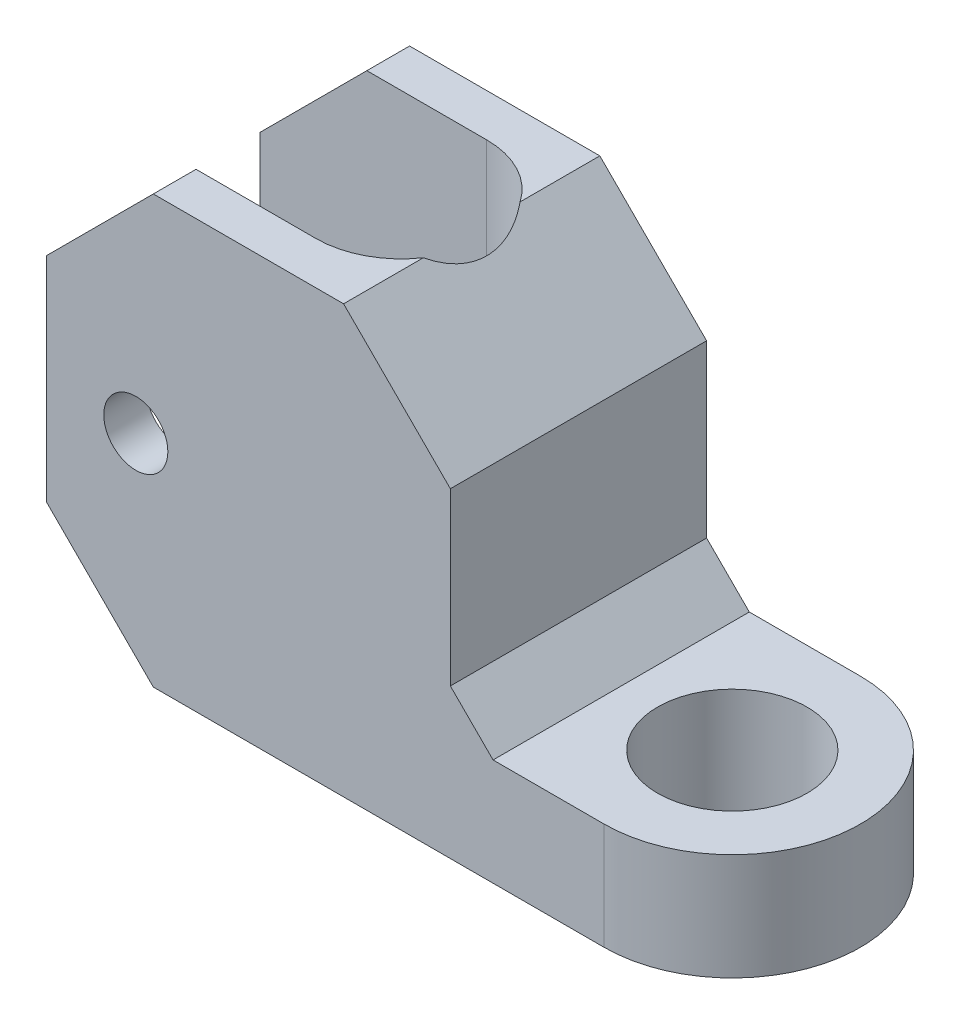
ISO-10303-21;
HEADER;
FILE_DESCRIPTION(('STEP AP214'),'2;1');
FILE_NAME('part.step','',(''),(''),'','','');
FILE_SCHEMA(('AUTOMOTIVE_DESIGN { 1 0 10303 214 1 1 1 1 }'));
ENDSEC;
DATA;
#1=APPLICATION_CONTEXT('core data for automotive mechanical design processes');
#2=APPLICATION_PROTOCOL_DEFINITION('international standard','automotive_design',2000,#1);
#3=PRODUCT_CONTEXT('',#1,'mechanical');
#4=PRODUCT('Part','Part','',(#3));
#5=PRODUCT_RELATED_PRODUCT_CATEGORY('part','',(#4));
#6=PRODUCT_DEFINITION_FORMATION('','',#4);
#7=PRODUCT_DEFINITION_CONTEXT('part definition',#1,'design');
#8=PRODUCT_DEFINITION('design','',#6,#7);
#9=PRODUCT_DEFINITION_SHAPE('','',#8);
#10=(LENGTH_UNIT() NAMED_UNIT(*) SI_UNIT(.MILLI.,.METRE.));
#11=(NAMED_UNIT(*) PLANE_ANGLE_UNIT() SI_UNIT($,.RADIAN.));
#12=(NAMED_UNIT(*) SI_UNIT($,.STERADIAN.) SOLID_ANGLE_UNIT());
#13=UNCERTAINTY_MEASURE_WITH_UNIT(LENGTH_MEASURE(1.E-05),#10,'distance_accuracy_value','');
#14=(GEOMETRIC_REPRESENTATION_CONTEXT(3) GLOBAL_UNCERTAINTY_ASSIGNED_CONTEXT((#13)) GLOBAL_UNIT_ASSIGNED_CONTEXT((#10,
#11,#12)) REPRESENTATION_CONTEXT('',''));
#15=CARTESIAN_POINT('',(0.,0.,0.));
#16=DIRECTION('',(0.,0.,1.));
#17=DIRECTION('',(1.,0.,0.));
#18=AXIS2_PLACEMENT_3D('',#15,#16,#17);
#19=CARTESIAN_POINT('',(0.,20.,0.));
#20=DIRECTION('',(0.,1.,0.));
#21=DIRECTION('',(0.,0.,1.));
#22=AXIS2_PLACEMENT_3D('',#19,#20,#21);
#23=PLANE('',#22);
#24=DIRECTION('',(-1.,0.,0.));
#25=VECTOR('',#24,1.);
#26=CARTESIAN_POINT('',(0.,20.,4.));
#27=LINE('',#26,#25);
#28=CARTESIAN_POINT('',(0.,20.,4.));
#29=VERTEX_POINT('',#28);
#30=CARTESIAN_POINT('',(-5.61459038752232,20.,4.));
#31=VERTEX_POINT('',#30);
#32=EDGE_CURVE('E178',#29,#31,#27,.T.);
#33=ORIENTED_EDGE('',*,*,#32,.T.);
#34=DIRECTION('',(0.,0.,1.));
#35=VECTOR('',#34,1.);
#36=CARTESIAN_POINT('',(-5.61459038752232,20.,6.));
#37=LINE('',#36,#35);
#38=CARTESIAN_POINT('',(-5.61459038752232,20.,6.));
#39=VERTEX_POINT('',#38);
#40=EDGE_CURVE('E280',#31,#39,#37,.T.);
#41=ORIENTED_EDGE('',*,*,#40,.T.);
#42=DIRECTION('',(1.,0.,0.));
#43=VECTOR('',#42,1.);
#44=CARTESIAN_POINT('',(-10.6145903875223,20.,6.));
#45=LINE('',#44,#43);
#46=CARTESIAN_POINT('',(3.29596161791093,20.,6.));
#47=VERTEX_POINT('',#46);
#48=EDGE_CURVE('E181',#39,#47,#45,.T.);
#49=ORIENTED_EDGE('',*,*,#48,.T.);
#50=DIRECTION('',(0.,0.,-1.));
#51=VECTOR('',#50,1.);
#52=CARTESIAN_POINT('',(3.29596161791093,20.,-6.));
#53=LINE('',#52,#51);
#54=CARTESIAN_POINT('',(3.29596161791093,20.,2.26641501346465));
#55=VERTEX_POINT('',#54);
#56=EDGE_CURVE('E239',#47,#55,#53,.T.);
#57=ORIENTED_EDGE('',*,*,#56,.T.);
#58=CARTESIAN_POINT('',(0.,20.,0.));
#59=DIRECTION('',(0.,-1.,0.));
#60=DIRECTION('',(0.,0.,1.));
#61=AXIS2_PLACEMENT_3D('',#58,#59,#60);
#62=CIRCLE('',#61,4.);
#63=EDGE_CURVE('E161',#55,#29,#62,.T.);
#64=ORIENTED_EDGE('',*,*,#63,.T.);
#65=EDGE_LOOP('',(#33,#41,#49,#57,#64));
#66=FACE_BOUND('',#65,.T.);
#67=ADVANCED_FACE('F33',(#66),#23,.T.);
#68=CARTESIAN_POINT('',(15.5,5.,0.));
#69=DIRECTION('',(0.,-1.,0.));
#70=DIRECTION('',(0.,0.,-1.));
#71=AXIS2_PLACEMENT_3D('',#68,#69,#70);
#72=PLANE('',#71);
#73=CARTESIAN_POINT('',(15.5,5.,0.));
#74=DIRECTION('',(0.,1.,0.));
#75=DIRECTION('',(0.,0.,1.));
#76=AXIS2_PLACEMENT_3D('',#73,#74,#75);
#77=CIRCLE('',#76,3.5);
#78=CARTESIAN_POINT('',(15.5,5.,3.5));
#79=VERTEX_POINT('',#78);
#80=EDGE_CURVE('E194',#79,#79,#77,.T.);
#81=ORIENTED_EDGE('',*,*,#80,.F.);
#82=EDGE_LOOP('',(#81));
#83=FACE_BOUND('',#82,.T.);
#84=DIRECTION('',(-1.,0.,0.));
#85=VECTOR('',#84,1.);
#86=CARTESIAN_POINT('',(-10.6145903875223,5.,-6.));
#87=LINE('',#86,#85);
#88=CARTESIAN_POINT('',(15.5,5.,-6.));
#89=VERTEX_POINT('',#88);
#90=CARTESIAN_POINT('',(10.295961617911,5.,-6.));
#91=VERTEX_POINT('',#90);
#92=EDGE_CURVE('E199',#89,#91,#87,.T.);
#93=ORIENTED_EDGE('',*,*,#92,.T.);
#94=DIRECTION('',(0.,0.,1.));
#95=VECTOR('',#94,1.);
#96=CARTESIAN_POINT('',(10.295961617911,5.,6.));
#97=LINE('',#96,#95);
#98=CARTESIAN_POINT('',(10.295961617911,5.,6.));
#99=VERTEX_POINT('',#98);
#100=EDGE_CURVE('E54',#91,#99,#97,.T.);
#101=ORIENTED_EDGE('',*,*,#100,.T.);
#102=DIRECTION('',(1.,0.,0.));
#103=VECTOR('',#102,1.);
#104=CARTESIAN_POINT('',(15.5,5.,6.));
#105=LINE('',#104,#103);
#106=CARTESIAN_POINT('',(15.5,5.,6.));
#107=VERTEX_POINT('',#106);
#108=EDGE_CURVE('E201',#99,#107,#105,.T.);
#109=ORIENTED_EDGE('',*,*,#108,.T.);
#110=CARTESIAN_POINT('',(15.5,5.,0.));
#111=DIRECTION('',(0.,1.,0.));
#112=DIRECTION('',(0.,0.,-1.));
#113=AXIS2_PLACEMENT_3D('',#110,#111,#112);
#114=CIRCLE('',#113,6.);
#115=EDGE_CURVE('E204',#107,#89,#114,.T.);
#116=ORIENTED_EDGE('',*,*,#115,.T.);
#117=EDGE_LOOP('',(#93,#101,#109,#116));
#118=FACE_BOUND('',#117,.T.);
#119=ADVANCED_FACE('F315',(#83,#118),#72,.F.);
#120=CARTESIAN_POINT('',(15.5,0.,0.));
#121=DIRECTION('',(0.,-1.,0.));
#122=DIRECTION('',(0.,0.,-1.));
#123=AXIS2_PLACEMENT_3D('',#120,#121,#122);
#124=PLANE('',#123);
#125=DIRECTION('',(1.,0.,0.));
#126=VECTOR('',#125,1.);
#127=CARTESIAN_POINT('',(15.5,0.,6.));
#128=LINE('',#127,#126);
#129=CARTESIAN_POINT('',(-5.61459038752231,0.,6.));
#130=VERTEX_POINT('',#129);
#131=CARTESIAN_POINT('',(15.5,0.,6.));
#132=VERTEX_POINT('',#131);
#133=EDGE_CURVE('E214',#130,#132,#128,.T.);
#134=ORIENTED_EDGE('',*,*,#133,.F.);
#135=DIRECTION('',(0.,0.,-1.));
#136=VECTOR('',#135,1.);
#137=CARTESIAN_POINT('',(-5.61459038752231,0.,4.));
#138=LINE('',#137,#136);
#139=CARTESIAN_POINT('',(-5.61459038752231,0.,4.));
#140=VERTEX_POINT('',#139);
#141=EDGE_CURVE('E261',#130,#140,#138,.T.);
#142=ORIENTED_EDGE('',*,*,#141,.T.);
#143=DIRECTION('',(-1.,0.,0.));
#144=VECTOR('',#143,1.);
#145=CARTESIAN_POINT('',(-10.6145903875223,0.,4.));
#146=LINE('',#145,#144);
#147=CARTESIAN_POINT('',(0.,0.,4.));
#148=VERTEX_POINT('',#147);
#149=EDGE_CURVE('E211',#148,#140,#146,.T.);
#150=ORIENTED_EDGE('',*,*,#149,.F.);
#151=CARTESIAN_POINT('',(0.,0.,0.));
#152=DIRECTION('',(0.,-1.,0.));
#153=DIRECTION('',(0.,0.,1.));
#154=AXIS2_PLACEMENT_3D('',#151,#152,#153);
#155=CIRCLE('',#154,4.);
#156=CARTESIAN_POINT('',(0.,0.,-4.));
#157=VERTEX_POINT('',#156);
#158=EDGE_CURVE('E209',#157,#148,#155,.T.);
#159=ORIENTED_EDGE('',*,*,#158,.F.);
#160=DIRECTION('',(1.,0.,0.));
#161=VECTOR('',#160,1.);
#162=CARTESIAN_POINT('',(0.,0.,-4.));
#163=LINE('',#162,#161);
#164=CARTESIAN_POINT('',(-5.61459038752231,0.,-4.));
#165=VERTEX_POINT('',#164);
#166=EDGE_CURVE('E169',#165,#157,#163,.T.);
#167=ORIENTED_EDGE('',*,*,#166,.F.);
#168=DIRECTION('',(0.,0.,-1.));
#169=VECTOR('',#168,1.);
#170=CARTESIAN_POINT('',(-5.61459038752231,0.,-6.));
#171=LINE('',#170,#169);
#172=CARTESIAN_POINT('',(-5.61459038752231,0.,-6.));
#173=VERTEX_POINT('',#172);
#174=EDGE_CURVE('E259',#165,#173,#171,.T.);
#175=ORIENTED_EDGE('',*,*,#174,.T.);
#176=DIRECTION('',(-1.,0.,0.));
#177=VECTOR('',#176,1.);
#178=CARTESIAN_POINT('',(0.,0.,-6.));
#179=LINE('',#178,#177);
#180=CARTESIAN_POINT('',(15.5,0.,-6.));
#181=VERTEX_POINT('',#180);
#182=EDGE_CURVE('E202',#181,#173,#179,.T.);
#183=ORIENTED_EDGE('',*,*,#182,.F.);
#184=CARTESIAN_POINT('',(15.5,0.,0.));
#185=DIRECTION('',(0.,1.,0.));
#186=DIRECTION('',(0.,0.,-1.));
#187=AXIS2_PLACEMENT_3D('',#184,#185,#186);
#188=CIRCLE('',#187,6.);
#189=EDGE_CURVE('E216',#132,#181,#188,.T.);
#190=ORIENTED_EDGE('',*,*,#189,.F.);
#191=EDGE_LOOP('',(#134,#142,#150,#159,#167,#175,#183,#190));
#192=FACE_BOUND('',#191,.T.);
#193=CARTESIAN_POINT('',(15.5,0.,0.));
#194=DIRECTION('',(0.,1.,0.));
#195=DIRECTION('',(0.,0.,1.));
#196=AXIS2_PLACEMENT_3D('',#193,#194,#195);
#197=CIRCLE('',#196,3.5);
#198=CARTESIAN_POINT('',(15.5,0.,3.5));
#199=VERTEX_POINT('',#198);
#200=EDGE_CURVE('E193',#199,#199,#197,.T.);
#201=ORIENTED_EDGE('',*,*,#200,.T.);
#202=EDGE_LOOP('',(#201));
#203=FACE_BOUND('',#202,.T.);
#204=ADVANCED_FACE('F321',(#192,#203),#124,.T.);
#205=CARTESIAN_POINT('',(-10.6145903875223,5.,-4.));
#206=DIRECTION('',(1.,0.,0.));
#207=DIRECTION('',(0.,0.,-1.));
#208=AXIS2_PLACEMENT_3D('',#205,#206,#207);
#209=PLANE('',#208);
#210=DIRECTION('',(0.,-1.,0.));
#211=VECTOR('',#210,1.);
#212=CARTESIAN_POINT('',(-10.6145903875223,5.,-6.));
#213=LINE('',#212,#211);
#214=CARTESIAN_POINT('',(-10.6145903875223,15.,-6.));
#215=VERTEX_POINT('',#214);
#216=CARTESIAN_POINT('',(-10.6145903875223,5.,-6.));
#217=VERTEX_POINT('',#216);
#218=EDGE_CURVE('E234',#215,#217,#213,.T.);
#219=ORIENTED_EDGE('',*,*,#218,.T.);
#220=DIRECTION('',(0.,0.,1.));
#221=VECTOR('',#220,1.);
#222=CARTESIAN_POINT('',(-10.6145903875223,5.,-4.));
#223=LINE('',#222,#221);
#224=CARTESIAN_POINT('',(-10.6145903875223,5.,-4.));
#225=VERTEX_POINT('',#224);
#226=EDGE_CURVE('E269',#217,#225,#223,.T.);
#227=ORIENTED_EDGE('',*,*,#226,.T.);
#228=DIRECTION('',(0.,-1.,0.));
#229=VECTOR('',#228,1.);
#230=CARTESIAN_POINT('',(-10.6145903875223,5.,-4.));
#231=LINE('',#230,#229);
#232=CARTESIAN_POINT('',(-10.6145903875223,15.,-4.));
#233=VERTEX_POINT('',#232);
#234=EDGE_CURVE('E172',#233,#225,#231,.T.);
#235=ORIENTED_EDGE('',*,*,#234,.F.);
#236=DIRECTION('',(0.,0.,-1.));
#237=VECTOR('',#236,1.);
#238=CARTESIAN_POINT('',(-10.6145903875223,15.,-6.));
#239=LINE('',#238,#237);
#240=EDGE_CURVE('E267',#233,#215,#239,.T.);
#241=ORIENTED_EDGE('',*,*,#240,.T.);
#242=EDGE_LOOP('',(#219,#227,#235,#241));
#243=FACE_BOUND('',#242,.T.);
#244=ADVANCED_FACE('F341',(#243),#209,.F.);
#245=CARTESIAN_POINT('',(0.,5.,-4.));
#246=DIRECTION('',(0.,0.,-1.));
#247=DIRECTION('',(-1.,0.,0.));
#248=AXIS2_PLACEMENT_3D('',#245,#246,#247);
#249=PLANE('',#248);
#250=CARTESIAN_POINT('',(-6.43466811292947,9.88266285041561,-4.));
#251=DIRECTION('',(0.,0.,-1.));
#252=DIRECTION('',(-1.,0.,0.));
#253=AXIS2_PLACEMENT_3D('',#250,#251,#252);
#254=CIRCLE('',#253,1.5);
#255=CARTESIAN_POINT('',(-7.93466811292947,9.88266285041561,-4.));
#256=VERTEX_POINT('',#255);
#257=EDGE_CURVE('E162',#256,#256,#254,.T.);
#258=ORIENTED_EDGE('',*,*,#257,.T.);
#259=EDGE_LOOP('',(#258));
#260=FACE_BOUND('',#259,.T.);
#261=ORIENTED_EDGE('',*,*,#234,.T.);
#262=DIRECTION('',(0.707106781186548,-0.707106781186547,0.));
#263=VECTOR('',#262,1.);
#264=CARTESIAN_POINT('',(-10.6145903875223,5.,-4.));
#265=LINE('',#264,#263);
#266=EDGE_CURVE('E274',#225,#165,#265,.T.);
#267=ORIENTED_EDGE('',*,*,#266,.T.);
#268=ORIENTED_EDGE('',*,*,#166,.T.);
#269=DIRECTION('',(0.,-1.,0.));
#270=VECTOR('',#269,1.);
#271=CARTESIAN_POINT('',(0.,5.,-4.));
#272=LINE('',#271,#270);
#273=CARTESIAN_POINT('',(0.,20.,-4.));
#274=VERTEX_POINT('',#273);
#275=EDGE_CURVE('E165',#274,#157,#272,.T.);
#276=ORIENTED_EDGE('',*,*,#275,.F.);
#277=DIRECTION('',(1.,0.,0.));
#278=VECTOR('',#277,1.);
#279=CARTESIAN_POINT('',(-10.6145903875223,20.,-4.));
#280=LINE('',#279,#278);
#281=CARTESIAN_POINT('',(-5.61459038752232,20.,-4.));
#282=VERTEX_POINT('',#281);
#283=EDGE_CURVE('E151',#282,#274,#280,.T.);
#284=ORIENTED_EDGE('',*,*,#283,.F.);
#285=DIRECTION('',(-0.707106781186547,-0.707106781186548,0.));
#286=VECTOR('',#285,1.);
#287=CARTESIAN_POINT('',(-5.61459038752232,20.,-4.));
#288=LINE('',#287,#286);
#289=EDGE_CURVE('E272',#282,#233,#288,.T.);
#290=ORIENTED_EDGE('',*,*,#289,.T.);
#291=EDGE_LOOP('',(#261,#267,#268,#276,#284,#290));
#292=FACE_BOUND('',#291,.T.);
#293=ADVANCED_FACE('F167',(#260,#292),#249,.F.);
#294=CARTESIAN_POINT('',(0.,5.,0.));
#295=DIRECTION('',(0.,-1.,0.));
#296=DIRECTION('',(0.,0.,-1.));
#297=AXIS2_PLACEMENT_3D('',#294,#295,#296);
#298=CYLINDRICAL_SURFACE('',#297,4.);
#299=ORIENTED_EDGE('',*,*,#63,.F.);
#300=CARTESIAN_POINT('',(0.,23.2959616179109,0.));
#301=DIRECTION('',(0.707106781186544,0.707106781186551,0.));
#302=DIRECTION('',(0.707106781186551,-0.707106781186544,0.));
#303=AXIS2_PLACEMENT_3D('',#300,#301,#302);
#304=ELLIPSE('',#303,5.65685424949235,4.);
#305=CARTESIAN_POINT('',(3.29596161791093,20.,-2.26641501346465));
#306=VERTEX_POINT('',#305);
#307=EDGE_CURVE('E177',#55,#306,#304,.T.);
#308=ORIENTED_EDGE('',*,*,#307,.T.);
#309=EDGE_CURVE('E156',#274,#306,#62,.T.);
#310=ORIENTED_EDGE('',*,*,#309,.F.);
#311=ORIENTED_EDGE('',*,*,#275,.T.);
#312=ORIENTED_EDGE('',*,*,#158,.T.);
#313=DIRECTION('',(0.,-1.,0.));
#314=VECTOR('',#313,1.);
#315=CARTESIAN_POINT('',(0.,5.,4.));
#316=LINE('',#315,#314);
#317=EDGE_CURVE('E173',#29,#148,#316,.T.);
#318=ORIENTED_EDGE('',*,*,#317,.F.);
#319=EDGE_LOOP('',(#299,#308,#310,#311,#312,#318));
#320=FACE_BOUND('',#319,.T.);
#321=ADVANCED_FACE('F176',(#320),#298,.F.);
#322=CARTESIAN_POINT('',(-10.6145903875223,5.,4.));
#323=DIRECTION('',(0.,0.,1.));
#324=DIRECTION('',(1.,0.,0.));
#325=AXIS2_PLACEMENT_3D('',#322,#323,#324);
#326=PLANE('',#325);
#327=CARTESIAN_POINT('',(-6.43466811292947,9.88266285041561,4.));
#328=DIRECTION('',(0.,0.,1.));
#329=DIRECTION('',(1.,0.,0.));
#330=AXIS2_PLACEMENT_3D('',#327,#328,#329);
#331=CIRCLE('',#330,1.5);
#332=CARTESIAN_POINT('',(-4.93466811292947,9.88266285041561,4.));
#333=VERTEX_POINT('',#332);
#334=EDGE_CURVE('E421',#333,#333,#331,.T.);
#335=ORIENTED_EDGE('',*,*,#334,.T.);
#336=EDGE_LOOP('',(#335));
#337=FACE_BOUND('',#336,.T.);
#338=ORIENTED_EDGE('',*,*,#149,.T.);
#339=DIRECTION('',(-0.707106781186549,0.707106781186546,0.));
#340=VECTOR('',#339,1.);
#341=CARTESIAN_POINT('',(-10.6145903875223,5.,4.));
#342=LINE('',#341,#340);
#343=CARTESIAN_POINT('',(-10.6145903875223,5.,4.));
#344=VERTEX_POINT('',#343);
#345=EDGE_CURVE('E265',#140,#344,#342,.T.);
#346=ORIENTED_EDGE('',*,*,#345,.T.);
#347=DIRECTION('',(0.,-1.,0.));
#348=VECTOR('',#347,1.);
#349=CARTESIAN_POINT('',(-10.6145903875223,5.,4.));
#350=LINE('',#349,#348);
#351=CARTESIAN_POINT('',(-10.6145903875223,15.,4.));
#352=VERTEX_POINT('',#351);
#353=EDGE_CURVE('E228',#352,#344,#350,.T.);
#354=ORIENTED_EDGE('',*,*,#353,.F.);
#355=DIRECTION('',(0.707106781186547,0.707106781186548,0.));
#356=VECTOR('',#355,1.);
#357=CARTESIAN_POINT('',(-5.61459038752232,20.,4.));
#358=LINE('',#357,#356);
#359=EDGE_CURVE('E263',#352,#31,#358,.T.);
#360=ORIENTED_EDGE('',*,*,#359,.T.);
#361=ORIENTED_EDGE('',*,*,#32,.F.);
#362=ORIENTED_EDGE('',*,*,#317,.T.);
#363=EDGE_LOOP('',(#338,#346,#354,#360,#361,#362));
#364=FACE_BOUND('',#363,.T.);
#365=ADVANCED_FACE('F356',(#337,#364),#326,.F.);
#366=CARTESIAN_POINT('',(-10.6145903875223,5.,6.));
#367=DIRECTION('',(1.,0.,0.));
#368=DIRECTION('',(0.,0.,-1.));
#369=AXIS2_PLACEMENT_3D('',#366,#367,#368);
#370=PLANE('',#369);
#371=ORIENTED_EDGE('',*,*,#353,.T.);
#372=DIRECTION('',(0.,0.,1.));
#373=VECTOR('',#372,1.);
#374=CARTESIAN_POINT('',(-10.6145903875223,5.,6.));
#375=LINE('',#374,#373);
#376=CARTESIAN_POINT('',(-10.6145903875223,5.,6.));
#377=VERTEX_POINT('',#376);
#378=EDGE_CURVE('E252',#344,#377,#375,.T.);
#379=ORIENTED_EDGE('',*,*,#378,.T.);
#380=DIRECTION('',(0.,-1.,0.));
#381=VECTOR('',#380,1.);
#382=CARTESIAN_POINT('',(-10.6145903875223,5.,6.));
#383=LINE('',#382,#381);
#384=CARTESIAN_POINT('',(-10.6145903875223,15.,6.));
#385=VERTEX_POINT('',#384);
#386=EDGE_CURVE('E225',#385,#377,#383,.T.);
#387=ORIENTED_EDGE('',*,*,#386,.F.);
#388=DIRECTION('',(0.,0.,-1.));
#389=VECTOR('',#388,1.);
#390=CARTESIAN_POINT('',(-10.6145903875223,15.,4.));
#391=LINE('',#390,#389);
#392=EDGE_CURVE('E250',#385,#352,#391,.T.);
#393=ORIENTED_EDGE('',*,*,#392,.T.);
#394=EDGE_LOOP('',(#371,#379,#387,#393));
#395=FACE_BOUND('',#394,.T.);
#396=ADVANCED_FACE('F352',(#395),#370,.F.);
#397=CARTESIAN_POINT('',(15.5,5.,6.));
#398=DIRECTION('',(0.,0.,-1.));
#399=DIRECTION('',(-1.,0.,0.));
#400=AXIS2_PLACEMENT_3D('',#397,#398,#399);
#401=PLANE('',#400);
#402=CARTESIAN_POINT('',(-6.43466811292947,9.88266285041561,6.));
#403=DIRECTION('',(0.,0.,-1.));
#404=DIRECTION('',(-1.,0.,0.));
#405=AXIS2_PLACEMENT_3D('',#402,#403,#404);
#406=CIRCLE('',#405,1.5);
#407=CARTESIAN_POINT('',(-7.93466811292947,9.88266285041561,6.));
#408=VERTEX_POINT('',#407);
#409=EDGE_CURVE('E423',#408,#408,#406,.T.);
#410=ORIENTED_EDGE('',*,*,#409,.T.);
#411=EDGE_LOOP('',(#410));
#412=FACE_BOUND('',#411,.T.);
#413=ORIENTED_EDGE('',*,*,#386,.T.);
#414=DIRECTION('',(0.707106781186549,-0.707106781186546,0.));
#415=VECTOR('',#414,1.);
#416=CARTESIAN_POINT('',(-10.6145903875223,5.,6.));
#417=LINE('',#416,#415);
#418=EDGE_CURVE('E257',#377,#130,#417,.T.);
#419=ORIENTED_EDGE('',*,*,#418,.T.);
#420=ORIENTED_EDGE('',*,*,#133,.T.);
#421=DIRECTION('',(0.,-1.,0.));
#422=VECTOR('',#421,1.);
#423=CARTESIAN_POINT('',(15.5,5.,6.));
#424=LINE('',#423,#422);
#425=EDGE_CURVE('E222',#107,#132,#424,.T.);
#426=ORIENTED_EDGE('',*,*,#425,.F.);
#427=ORIENTED_EDGE('',*,*,#108,.F.);
#428=DIRECTION('',(0.707106781186544,-0.707106781186551,0.));
#429=VECTOR('',#428,1.);
#430=CARTESIAN_POINT('',(12.8979808089555,2.39798080895551,6.));
#431=LINE('',#430,#429);
#432=CARTESIAN_POINT('',(8.29596161791102,7.00000000000002,6.));
#433=VERTEX_POINT('',#432);
#434=EDGE_CURVE('E11',#99,#433,#431,.F.);
#435=ORIENTED_EDGE('',*,*,#434,.T.);
#436=DIRECTION('',(0.,-1.,0.));
#437=VECTOR('',#436,1.);
#438=CARTESIAN_POINT('',(8.29596161791102,20.,6.));
#439=LINE('',#438,#437);
#440=CARTESIAN_POINT('',(8.29596161791102,15.,6.));
#441=VERTEX_POINT('',#440);
#442=EDGE_CURVE('E190',#441,#433,#439,.T.);
#443=ORIENTED_EDGE('',*,*,#442,.F.);
#444=DIRECTION('',(-0.707106781186551,0.707106781186544,0.));
#445=VECTOR('',#444,1.);
#446=CARTESIAN_POINT('',(3.29596161791093,20.,6.));
#447=LINE('',#446,#445);
#448=EDGE_CURVE('E247',#441,#47,#447,.T.);
#449=ORIENTED_EDGE('',*,*,#448,.T.);
#450=ORIENTED_EDGE('',*,*,#48,.F.);
#451=DIRECTION('',(-0.707106781186547,-0.707106781186548,0.));
#452=VECTOR('',#451,1.);
#453=CARTESIAN_POINT('',(-5.61459038752232,20.,6.));
#454=LINE('',#453,#452);
#455=EDGE_CURVE('E255',#39,#385,#454,.T.);
#456=ORIENTED_EDGE('',*,*,#455,.T.);
#457=EDGE_LOOP('',(#413,#419,#420,#426,#427,#435,#443,#449,#450,#456));
#458=FACE_BOUND('',#457,.T.);
#459=ADVANCED_FACE('F303',(#412,#458),#401,.F.);
#460=CARTESIAN_POINT('',(15.5,5.,0.));
#461=DIRECTION('',(0.,-1.,0.));
#462=DIRECTION('',(0.,0.,-1.));
#463=AXIS2_PLACEMENT_3D('',#460,#461,#462);
#464=CYLINDRICAL_SURFACE('',#463,6.);
#465=ORIENTED_EDGE('',*,*,#189,.T.);
#466=DIRECTION('',(0.,-1.,0.));
#467=VECTOR('',#466,1.);
#468=CARTESIAN_POINT('',(15.5,5.,-6.));
#469=LINE('',#468,#467);
#470=EDGE_CURVE('E207',#89,#181,#469,.T.);
#471=ORIENTED_EDGE('',*,*,#470,.F.);
#472=ORIENTED_EDGE('',*,*,#115,.F.);
#473=ORIENTED_EDGE('',*,*,#425,.T.);
#474=EDGE_LOOP('',(#465,#471,#472,#473));
#475=FACE_BOUND('',#474,.T.);
#476=ADVANCED_FACE('F345',(#475),#464,.T.);
#477=CARTESIAN_POINT('',(0.,5.,-6.));
#478=DIRECTION('',(0.,0.,1.));
#479=DIRECTION('',(1.,0.,0.));
#480=AXIS2_PLACEMENT_3D('',#477,#478,#479);
#481=PLANE('',#480);
#482=CARTESIAN_POINT('',(-6.43466811292947,9.88266285041561,-6.));
#483=DIRECTION('',(0.,0.,1.));
#484=DIRECTION('',(1.,0.,0.));
#485=AXIS2_PLACEMENT_3D('',#482,#483,#484);
#486=CIRCLE('',#485,1.5);
#487=CARTESIAN_POINT('',(-4.93466811292947,9.88266285041561,-6.));
#488=VERTEX_POINT('',#487);
#489=EDGE_CURVE('E418',#488,#488,#486,.T.);
#490=ORIENTED_EDGE('',*,*,#489,.T.);
#491=EDGE_LOOP('',(#490));
#492=FACE_BOUND('',#491,.T.);
#493=ORIENTED_EDGE('',*,*,#182,.T.);
#494=DIRECTION('',(-0.707106781186548,0.707106781186547,0.));
#495=VECTOR('',#494,1.);
#496=CARTESIAN_POINT('',(-10.6145903875223,5.,-6.));
#497=LINE('',#496,#495);
#498=EDGE_CURVE('E278',#173,#217,#497,.T.);
#499=ORIENTED_EDGE('',*,*,#498,.T.);
#500=ORIENTED_EDGE('',*,*,#218,.F.);
#501=DIRECTION('',(0.707106781186547,0.707106781186548,0.));
#502=VECTOR('',#501,1.);
#503=CARTESIAN_POINT('',(-5.61459038752232,20.,-6.));
#504=LINE('',#503,#502);
#505=CARTESIAN_POINT('',(-5.61459038752232,20.,-6.));
#506=VERTEX_POINT('',#505);
#507=EDGE_CURVE('E276',#215,#506,#504,.T.);
#508=ORIENTED_EDGE('',*,*,#507,.T.);
#509=DIRECTION('',(-1.,0.,0.));
#510=VECTOR('',#509,1.);
#511=CARTESIAN_POINT('',(8.29596161791102,20.,-6.));
#512=LINE('',#511,#510);
#513=CARTESIAN_POINT('',(3.29596161791093,20.,-6.));
#514=VERTEX_POINT('',#513);
#515=EDGE_CURVE('E186',#514,#506,#512,.T.);
#516=ORIENTED_EDGE('',*,*,#515,.F.);
#517=DIRECTION('',(0.707106781186551,-0.707106781186544,0.));
#518=VECTOR('',#517,1.);
#519=CARTESIAN_POINT('',(3.29596161791093,20.,-6.));
#520=LINE('',#519,#518);
#521=CARTESIAN_POINT('',(8.29596161791102,15.,-6.));
#522=VERTEX_POINT('',#521);
#523=EDGE_CURVE('E243',#514,#522,#520,.T.);
#524=ORIENTED_EDGE('',*,*,#523,.T.);
#525=DIRECTION('',(0.,-1.,0.));
#526=VECTOR('',#525,1.);
#527=CARTESIAN_POINT('',(8.29596161791102,20.,-6.));
#528=LINE('',#527,#526);
#529=CARTESIAN_POINT('',(8.29596161791102,7.00000000000002,-6.));
#530=VERTEX_POINT('',#529);
#531=EDGE_CURVE('E188',#522,#530,#528,.T.);
#532=ORIENTED_EDGE('',*,*,#531,.T.);
#533=DIRECTION('',(-0.707106781186544,0.707106781186551,0.));
#534=VECTOR('',#533,1.);
#535=CARTESIAN_POINT('',(5.14798080895556,10.1479808089555,-6.));
#536=LINE('',#535,#534);
#537=EDGE_CURVE('E41',#530,#91,#536,.F.);
#538=ORIENTED_EDGE('',*,*,#537,.T.);
#539=ORIENTED_EDGE('',*,*,#92,.F.);
#540=ORIENTED_EDGE('',*,*,#470,.T.);
#541=EDGE_LOOP('',(#493,#499,#500,#508,#516,#524,#532,#538,#539,#540));
#542=FACE_BOUND('',#541,.T.);
#543=ADVANCED_FACE('F295',(#492,#542),#481,.F.);
#544=CARTESIAN_POINT('',(15.5,5.,0.));
#545=DIRECTION('',(0.,-1.,0.));
#546=DIRECTION('',(0.,0.,-1.));
#547=AXIS2_PLACEMENT_3D('',#544,#545,#546);
#548=CYLINDRICAL_SURFACE('',#547,3.5);
#549=ORIENTED_EDGE('',*,*,#80,.T.);
#550=EDGE_LOOP('',(#549));
#551=FACE_BOUND('',#550,.T.);
#552=ORIENTED_EDGE('',*,*,#200,.F.);
#553=EDGE_LOOP('',(#552));
#554=FACE_BOUND('',#553,.T.);
#555=ADVANCED_FACE('F332',(#551,#554),#548,.F.);
#556=CARTESIAN_POINT('',(8.29596161791102,20.,-6.));
#557=DIRECTION('',(-1.,0.,0.));
#558=DIRECTION('',(0.,0.,1.));
#559=AXIS2_PLACEMENT_3D('',#556,#557,#558);
#560=PLANE('',#559);
#561=ORIENTED_EDGE('',*,*,#442,.T.);
#562=DIRECTION('',(0.,0.,-1.));
#563=VECTOR('',#562,1.);
#564=CARTESIAN_POINT('',(8.29596161791102,7.00000000000002,-6.));
#565=LINE('',#564,#563);
#566=EDGE_CURVE('E284',#433,#530,#565,.T.);
#567=ORIENTED_EDGE('',*,*,#566,.T.);
#568=ORIENTED_EDGE('',*,*,#531,.F.);
#569=DIRECTION('',(0.,0.,1.));
#570=VECTOR('',#569,1.);
#571=CARTESIAN_POINT('',(8.29596161791102,15.,6.));
#572=LINE('',#571,#570);
#573=EDGE_CURVE('E245',#522,#441,#572,.T.);
#574=ORIENTED_EDGE('',*,*,#573,.T.);
#575=EDGE_LOOP('',(#561,#567,#568,#574));
#576=FACE_BOUND('',#575,.T.);
#577=ADVANCED_FACE('F290',(#576),#560,.F.);
#578=ORIENTED_EDGE('',*,*,#515,.T.);
#579=DIRECTION('',(0.,0.,1.));
#580=VECTOR('',#579,1.);
#581=CARTESIAN_POINT('',(-5.61459038752232,20.,-4.));
#582=LINE('',#581,#580);
#583=EDGE_CURVE('E159',#506,#282,#582,.T.);
#584=ORIENTED_EDGE('',*,*,#583,.T.);
#585=ORIENTED_EDGE('',*,*,#283,.T.);
#586=ORIENTED_EDGE('',*,*,#309,.T.);
#587=DIRECTION('',(0.,0.,-1.));
#588=VECTOR('',#587,1.);
#589=CARTESIAN_POINT('',(3.29596161791093,20.,-6.));
#590=LINE('',#589,#588);
#591=EDGE_CURVE('E237',#306,#514,#590,.T.);
#592=ORIENTED_EDGE('',*,*,#591,.T.);
#593=EDGE_LOOP('',(#578,#584,#585,#586,#592));
#594=FACE_BOUND('',#593,.T.);
#595=ADVANCED_FACE('F154',(#594),#23,.T.);
#596=CARTESIAN_POINT('',(3.29596161791093,20.,0.));
#597=DIRECTION('',(0.707106781186544,0.707106781186551,0.));
#598=DIRECTION('',(0.,0.,1.));
#599=AXIS2_PLACEMENT_3D('',#596,#597,#598);
#600=PLANE('',#599);
#601=ORIENTED_EDGE('',*,*,#448,.F.);
#602=ORIENTED_EDGE('',*,*,#573,.F.);
#603=ORIENTED_EDGE('',*,*,#523,.F.);
#604=ORIENTED_EDGE('',*,*,#591,.F.);
#605=ORIENTED_EDGE('',*,*,#307,.F.);
#606=ORIENTED_EDGE('',*,*,#56,.F.);
#607=EDGE_LOOP('',(#601,#602,#603,#604,#605,#606));
#608=FACE_BOUND('',#607,.T.);
#609=ADVANCED_FACE('F300',(#608),#600,.T.);
#610=CARTESIAN_POINT('',(-10.6145903875223,5.,6.));
#611=DIRECTION('',(-0.707106781186546,-0.707106781186549,0.));
#612=DIRECTION('',(0.,0.,-1.));
#613=AXIS2_PLACEMENT_3D('',#610,#611,#612);
#614=PLANE('',#613);
#615=ORIENTED_EDGE('',*,*,#345,.F.);
#616=ORIENTED_EDGE('',*,*,#141,.F.);
#617=ORIENTED_EDGE('',*,*,#418,.F.);
#618=ORIENTED_EDGE('',*,*,#378,.F.);
#619=EDGE_LOOP('',(#615,#616,#617,#618));
#620=FACE_BOUND('',#619,.T.);
#621=ADVANCED_FACE('F330',(#620),#614,.T.);
#622=CARTESIAN_POINT('',(-10.6145903875223,5.,-4.));
#623=DIRECTION('',(-0.707106781186547,-0.707106781186548,0.));
#624=DIRECTION('',(0.,0.,-1.));
#625=AXIS2_PLACEMENT_3D('',#622,#623,#624);
#626=PLANE('',#625);
#627=ORIENTED_EDGE('',*,*,#498,.F.);
#628=ORIENTED_EDGE('',*,*,#174,.F.);
#629=ORIENTED_EDGE('',*,*,#266,.F.);
#630=ORIENTED_EDGE('',*,*,#226,.F.);
#631=EDGE_LOOP('',(#627,#628,#629,#630));
#632=FACE_BOUND('',#631,.T.);
#633=ADVANCED_FACE('F371',(#632),#626,.T.);
#634=CARTESIAN_POINT('',(-5.61459038752232,20.,0.));
#635=DIRECTION('',(-0.707106781186548,0.707106781186547,0.));
#636=DIRECTION('',(0.,0.,-1.));
#637=AXIS2_PLACEMENT_3D('',#634,#635,#636);
#638=PLANE('',#637);
#639=ORIENTED_EDGE('',*,*,#359,.F.);
#640=ORIENTED_EDGE('',*,*,#392,.F.);
#641=ORIENTED_EDGE('',*,*,#455,.F.);
#642=ORIENTED_EDGE('',*,*,#40,.F.);
#643=EDGE_LOOP('',(#639,#640,#641,#642));
#644=FACE_BOUND('',#643,.T.);
#645=ADVANCED_FACE('F375',(#644),#638,.T.);
#646=CARTESIAN_POINT('',(-5.61459038752232,20.,0.));
#647=DIRECTION('',(-0.707106781186548,0.707106781186547,0.));
#648=DIRECTION('',(0.,0.,-1.));
#649=AXIS2_PLACEMENT_3D('',#646,#647,#648);
#650=PLANE('',#649);
#651=ORIENTED_EDGE('',*,*,#507,.F.);
#652=ORIENTED_EDGE('',*,*,#240,.F.);
#653=ORIENTED_EDGE('',*,*,#289,.F.);
#654=ORIENTED_EDGE('',*,*,#583,.F.);
#655=EDGE_LOOP('',(#651,#652,#653,#654));
#656=FACE_BOUND('',#655,.T.);
#657=ADVANCED_FACE('F378',(#656),#650,.T.);
#658=CARTESIAN_POINT('',(-6.43466811292947,9.88266285041561,-6.));
#659=DIRECTION('',(0.,0.,1.));
#660=DIRECTION('',(1.,0.,0.));
#661=AXIS2_PLACEMENT_3D('',#658,#659,#660);
#662=CYLINDRICAL_SURFACE('',#661,1.5);
#663=ORIENTED_EDGE('',*,*,#489,.F.);
#664=EDGE_LOOP('',(#663));
#665=FACE_BOUND('',#664,.T.);
#666=ORIENTED_EDGE('',*,*,#257,.F.);
#667=EDGE_LOOP('',(#666));
#668=FACE_BOUND('',#667,.T.);
#669=ADVANCED_FACE('F311',(#665,#668),#662,.F.);
#670=ORIENTED_EDGE('',*,*,#409,.F.);
#671=EDGE_LOOP('',(#670));
#672=FACE_BOUND('',#671,.T.);
#673=ORIENTED_EDGE('',*,*,#334,.F.);
#674=EDGE_LOOP('',(#673));
#675=FACE_BOUND('',#674,.T.);
#676=ADVANCED_FACE('F307',(#672,#675),#662,.F.);
#677=CARTESIAN_POINT('',(8.29596161791102,7.00000000000002,-6.));
#678=DIRECTION('',(0.707106781186551,0.707106781186544,0.));
#679=DIRECTION('',(0.,0.,1.));
#680=AXIS2_PLACEMENT_3D('',#677,#678,#679);
#681=PLANE('',#680);
#682=ORIENTED_EDGE('',*,*,#434,.F.);
#683=ORIENTED_EDGE('',*,*,#100,.F.);
#684=ORIENTED_EDGE('',*,*,#537,.F.);
#685=ORIENTED_EDGE('',*,*,#566,.F.);
#686=EDGE_LOOP('',(#682,#683,#684,#685));
#687=FACE_BOUND('',#686,.T.);
#688=ADVANCED_FACE('F35',(#687),#681,.T.);
#689=CLOSED_SHELL('',(#67,#119,#204,#244,#293,#321,#365,#396,#459,#476,#543,#555,#577,#595,#609,
#621,#633,#645,#657,#669,#676,#688));
#690=MANIFOLD_SOLID_BREP('B2',#689);
#691=ADVANCED_BREP_SHAPE_REPRESENTATION('',(#18,#690),#14);
#692=SHAPE_DEFINITION_REPRESENTATION(#9,#691);
ENDSEC;
END-ISO-10303-21;
